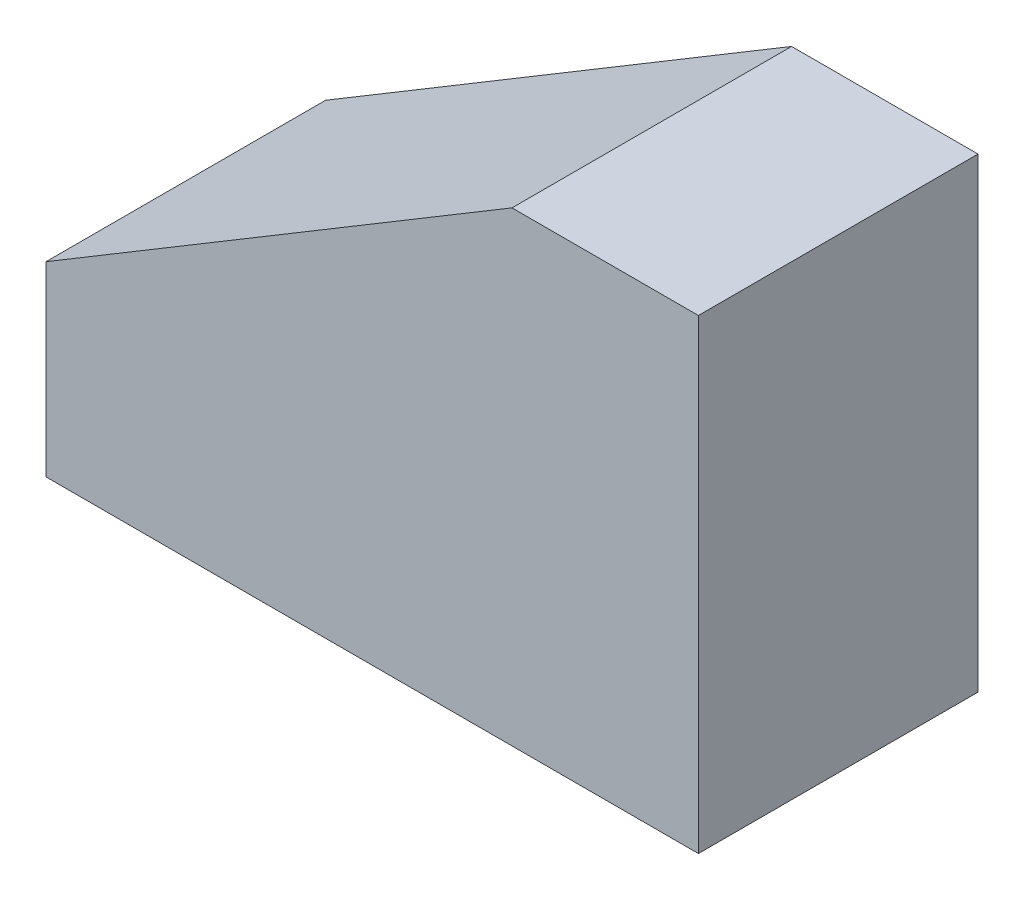
ISO-10303-21;
HEADER;
FILE_DESCRIPTION(('STEP AP214'),'2;1');
FILE_NAME('part.step','',(''),(''),'','','');
FILE_SCHEMA(('AUTOMOTIVE_DESIGN { 1 0 10303 214 1 1 1 1 }'));
ENDSEC;
DATA;
#1=APPLICATION_CONTEXT('core data for automotive mechanical design processes');
#2=APPLICATION_PROTOCOL_DEFINITION('international standard','automotive_design',2000,#1);
#3=PRODUCT_CONTEXT('',#1,'mechanical');
#4=PRODUCT('Part','Part','',(#3));
#5=PRODUCT_RELATED_PRODUCT_CATEGORY('part','',(#4));
#6=PRODUCT_DEFINITION_FORMATION('','',#4);
#7=PRODUCT_DEFINITION_CONTEXT('part definition',#1,'design');
#8=PRODUCT_DEFINITION('design','',#6,#7);
#9=PRODUCT_DEFINITION_SHAPE('','',#8);
#10=(LENGTH_UNIT() NAMED_UNIT(*) SI_UNIT(.MILLI.,.METRE.));
#11=(NAMED_UNIT(*) PLANE_ANGLE_UNIT() SI_UNIT($,.RADIAN.));
#12=(NAMED_UNIT(*) SI_UNIT($,.STERADIAN.) SOLID_ANGLE_UNIT());
#13=UNCERTAINTY_MEASURE_WITH_UNIT(LENGTH_MEASURE(1.E-05),#10,'distance_accuracy_value','');
#14=(GEOMETRIC_REPRESENTATION_CONTEXT(3) GLOBAL_UNCERTAINTY_ASSIGNED_CONTEXT((#13)) GLOBAL_UNIT_ASSIGNED_CONTEXT((#10,
#11,#12)) REPRESENTATION_CONTEXT('',''));
#15=CARTESIAN_POINT('',(0.,0.,0.));
#16=DIRECTION('',(0.,0.,1.));
#17=DIRECTION('',(1.,0.,0.));
#18=AXIS2_PLACEMENT_3D('',#15,#16,#17);
#19=CARTESIAN_POINT('',(0.,10.,15.));
#20=DIRECTION('',(1.,0.,0.));
#21=DIRECTION('',(0.,1.,0.));
#22=AXIS2_PLACEMENT_3D('',#19,#20,#21);
#23=PLANE('',#22);
#24=DIRECTION('',(0.,-1.,0.));
#25=VECTOR('',#24,1.);
#26=CARTESIAN_POINT('',(0.,10.,0.));
#27=LINE('',#26,#25);
#28=CARTESIAN_POINT('',(0.,10.,0.));
#29=VERTEX_POINT('',#28);
#30=CARTESIAN_POINT('',(0.,0.,0.));
#31=VERTEX_POINT('',#30);
#32=EDGE_CURVE('E107',#29,#31,#27,.T.);
#33=ORIENTED_EDGE('',*,*,#32,.T.);
#34=DIRECTION('',(0.,0.,-1.));
#35=VECTOR('',#34,1.);
#36=CARTESIAN_POINT('',(0.,0.,15.));
#37=LINE('',#36,#35);
#38=CARTESIAN_POINT('',(0.,0.,15.));
#39=VERTEX_POINT('',#38);
#40=EDGE_CURVE('E11',#39,#31,#37,.T.);
#41=ORIENTED_EDGE('',*,*,#40,.F.);
#42=DIRECTION('',(0.,-1.,0.));
#43=VECTOR('',#42,1.);
#44=CARTESIAN_POINT('',(0.,10.,15.));
#45=LINE('',#44,#43);
#46=CARTESIAN_POINT('',(0.,10.,15.));
#47=VERTEX_POINT('',#46);
#48=EDGE_CURVE('E115',#47,#39,#45,.T.);
#49=ORIENTED_EDGE('',*,*,#48,.F.);
#50=DIRECTION('',(0.,0.,-1.));
#51=VECTOR('',#50,1.);
#52=CARTESIAN_POINT('',(0.,10.,15.));
#53=LINE('',#52,#51);
#54=EDGE_CURVE('E103',#47,#29,#53,.T.);
#55=ORIENTED_EDGE('',*,*,#54,.T.);
#56=EDGE_LOOP('',(#33,#41,#49,#55));
#57=FACE_BOUND('',#56,.T.);
#58=ADVANCED_FACE('F33',(#57),#23,.F.);
#59=CARTESIAN_POINT('',(0.,0.,15.));
#60=DIRECTION('',(0.,1.,0.));
#61=DIRECTION('',(0.,0.,1.));
#62=AXIS2_PLACEMENT_3D('',#59,#60,#61);
#63=PLANE('',#62);
#64=DIRECTION('',(1.,0.,0.));
#65=VECTOR('',#64,1.);
#66=CARTESIAN_POINT('',(0.,0.,0.));
#67=LINE('',#66,#65);
#68=CARTESIAN_POINT('',(35.,0.,0.));
#69=VERTEX_POINT('',#68);
#70=EDGE_CURVE('E110',#31,#69,#67,.T.);
#71=ORIENTED_EDGE('',*,*,#70,.T.);
#72=DIRECTION('',(0.,0.,-1.));
#73=VECTOR('',#72,1.);
#74=CARTESIAN_POINT('',(35.,0.,15.));
#75=LINE('',#74,#73);
#76=CARTESIAN_POINT('',(35.,0.,15.));
#77=VERTEX_POINT('',#76);
#78=EDGE_CURVE('E41',#77,#69,#75,.T.);
#79=ORIENTED_EDGE('',*,*,#78,.F.);
#80=DIRECTION('',(1.,0.,0.));
#81=VECTOR('',#80,1.);
#82=CARTESIAN_POINT('',(0.,0.,15.));
#83=LINE('',#82,#81);
#84=EDGE_CURVE('E83',#39,#77,#83,.T.);
#85=ORIENTED_EDGE('',*,*,#84,.F.);
#86=ORIENTED_EDGE('',*,*,#40,.T.);
#87=EDGE_LOOP('',(#71,#79,#85,#86));
#88=FACE_BOUND('',#87,.T.);
#89=ADVANCED_FACE('F134',(#88),#63,.F.);
#90=CARTESIAN_POINT('',(35.,0.,15.));
#91=DIRECTION('',(-1.,0.,0.));
#92=DIRECTION('',(0.,0.,1.));
#93=AXIS2_PLACEMENT_3D('',#90,#91,#92);
#94=PLANE('',#93);
#95=DIRECTION('',(0.,1.,0.));
#96=VECTOR('',#95,1.);
#97=CARTESIAN_POINT('',(35.,0.,0.));
#98=LINE('',#97,#96);
#99=CARTESIAN_POINT('',(35.,25.,0.));
#100=VERTEX_POINT('',#99);
#101=EDGE_CURVE('E98',#69,#100,#98,.T.);
#102=ORIENTED_EDGE('',*,*,#101,.T.);
#103=DIRECTION('',(0.,0.,-1.));
#104=VECTOR('',#103,1.);
#105=CARTESIAN_POINT('',(35.,25.,15.));
#106=LINE('',#105,#104);
#107=CARTESIAN_POINT('',(35.,25.,15.));
#108=VERTEX_POINT('',#107);
#109=EDGE_CURVE('E95',#108,#100,#106,.T.);
#110=ORIENTED_EDGE('',*,*,#109,.F.);
#111=DIRECTION('',(0.,1.,0.));
#112=VECTOR('',#111,1.);
#113=CARTESIAN_POINT('',(35.,0.,15.));
#114=LINE('',#113,#112);
#115=EDGE_CURVE('E87',#77,#108,#114,.T.);
#116=ORIENTED_EDGE('',*,*,#115,.F.);
#117=ORIENTED_EDGE('',*,*,#78,.T.);
#118=EDGE_LOOP('',(#102,#110,#116,#117));
#119=FACE_BOUND('',#118,.T.);
#120=ADVANCED_FACE('F96',(#119),#94,.F.);
#121=CARTESIAN_POINT('',(35.,25.,15.));
#122=DIRECTION('',(0.,-1.,0.));
#123=DIRECTION('',(0.,0.,-1.));
#124=AXIS2_PLACEMENT_3D('',#121,#122,#123);
#125=PLANE('',#124);
#126=DIRECTION('',(-1.,0.,0.));
#127=VECTOR('',#126,1.);
#128=CARTESIAN_POINT('',(35.,25.,0.));
#129=LINE('',#128,#127);
#130=CARTESIAN_POINT('',(25.,25.,0.));
#131=VERTEX_POINT('',#130);
#132=EDGE_CURVE('E69',#100,#131,#129,.T.);
#133=ORIENTED_EDGE('',*,*,#132,.T.);
#134=DIRECTION('',(0.,0.,-1.));
#135=VECTOR('',#134,1.);
#136=CARTESIAN_POINT('',(25.,25.,15.));
#137=LINE('',#136,#135);
#138=CARTESIAN_POINT('',(25.,25.,15.));
#139=VERTEX_POINT('',#138);
#140=EDGE_CURVE('E99',#139,#131,#137,.T.);
#141=ORIENTED_EDGE('',*,*,#140,.F.);
#142=DIRECTION('',(-1.,0.,0.));
#143=VECTOR('',#142,1.);
#144=CARTESIAN_POINT('',(35.,25.,15.));
#145=LINE('',#144,#143);
#146=EDGE_CURVE('E91',#108,#139,#145,.T.);
#147=ORIENTED_EDGE('',*,*,#146,.F.);
#148=ORIENTED_EDGE('',*,*,#109,.T.);
#149=EDGE_LOOP('',(#133,#141,#147,#148));
#150=FACE_BOUND('',#149,.T.);
#151=ADVANCED_FACE('F101',(#150),#125,.F.);
#152=CARTESIAN_POINT('',(25.,25.,15.));
#153=DIRECTION('',(0.514495755427526,-0.857492925712544,0.));
#154=DIRECTION('',(0.857492925712544,0.514495755427527,0.));
#155=AXIS2_PLACEMENT_3D('',#152,#153,#154);
#156=PLANE('',#155);
#157=DIRECTION('',(-0.857492925712544,-0.514495755427527,0.));
#158=VECTOR('',#157,1.);
#159=CARTESIAN_POINT('',(25.,25.,0.));
#160=LINE('',#159,#158);
#161=EDGE_CURVE('E75',#131,#29,#160,.T.);
#162=ORIENTED_EDGE('',*,*,#161,.T.);
#163=ORIENTED_EDGE('',*,*,#54,.F.);
#164=DIRECTION('',(-0.857492925712544,-0.514495755427527,0.));
#165=VECTOR('',#164,1.);
#166=CARTESIAN_POINT('',(25.,25.,15.));
#167=LINE('',#166,#165);
#168=EDGE_CURVE('E49',#139,#47,#167,.T.);
#169=ORIENTED_EDGE('',*,*,#168,.F.);
#170=ORIENTED_EDGE('',*,*,#140,.T.);
#171=EDGE_LOOP('',(#162,#163,#169,#170));
#172=FACE_BOUND('',#171,.T.);
#173=ADVANCED_FACE('F123',(#172),#156,.F.);
#174=CARTESIAN_POINT('',(0.,0.,15.));
#175=DIRECTION('',(0.,0.,1.));
#176=DIRECTION('',(1.,0.,0.));
#177=AXIS2_PLACEMENT_3D('',#174,#175,#176);
#178=PLANE('',#177);
#179=ORIENTED_EDGE('',*,*,#48,.T.);
#180=ORIENTED_EDGE('',*,*,#84,.T.);
#181=ORIENTED_EDGE('',*,*,#115,.T.);
#182=ORIENTED_EDGE('',*,*,#146,.T.);
#183=ORIENTED_EDGE('',*,*,#168,.T.);
#184=EDGE_LOOP('',(#179,#180,#181,#182,#183));
#185=FACE_BOUND('',#184,.T.);
#186=ADVANCED_FACE('F89',(#185),#178,.T.);
#187=CARTESIAN_POINT('',(0.,0.,0.));
#188=DIRECTION('',(0.,0.,1.));
#189=DIRECTION('',(1.,0.,0.));
#190=AXIS2_PLACEMENT_3D('',#187,#188,#189);
#191=PLANE('',#190);
#192=ORIENTED_EDGE('',*,*,#32,.F.);
#193=ORIENTED_EDGE('',*,*,#161,.F.);
#194=ORIENTED_EDGE('',*,*,#132,.F.);
#195=ORIENTED_EDGE('',*,*,#101,.F.);
#196=ORIENTED_EDGE('',*,*,#70,.F.);
#197=EDGE_LOOP('',(#192,#193,#194,#195,#196));
#198=FACE_BOUND('',#197,.T.);
#199=ADVANCED_FACE('F119',(#198),#191,.F.);
#200=CLOSED_SHELL('',(#58,#89,#120,#151,#173,#186,#199));
#201=MANIFOLD_SOLID_BREP('B2',#200);
#202=ADVANCED_BREP_SHAPE_REPRESENTATION('',(#18,#201),#14);
#203=SHAPE_DEFINITION_REPRESENTATION(#9,#202);
ENDSEC;
END-ISO-10303-21;
